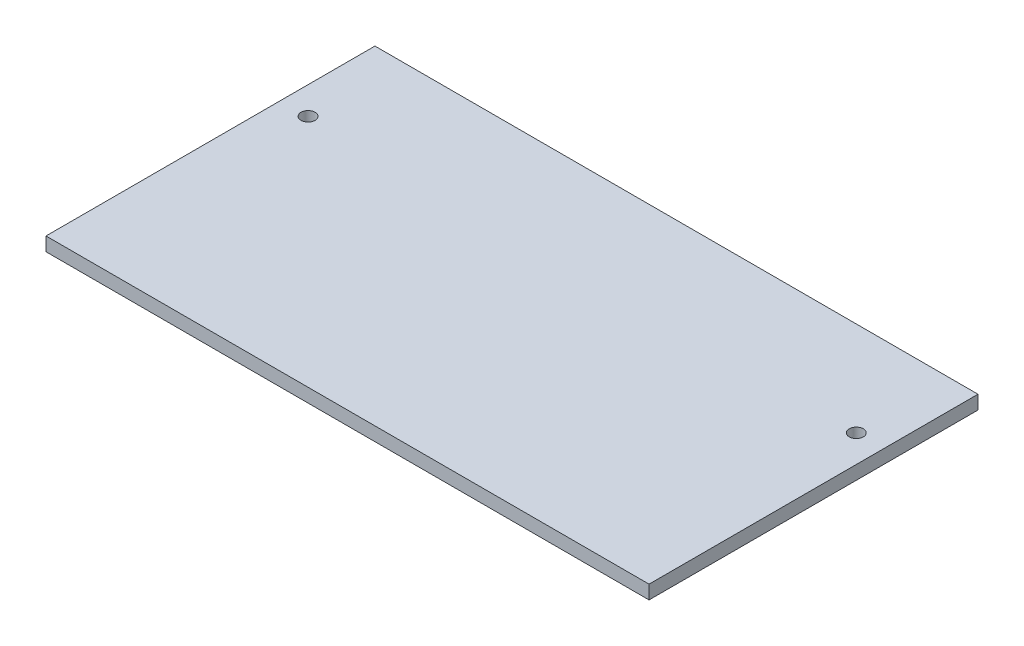
ISO-10303-21;
HEADER;
FILE_DESCRIPTION(('STEP AP214'),'2;1');
FILE_NAME('part.step','',(''),(''),'','','');
FILE_SCHEMA(('AUTOMOTIVE_DESIGN { 1 0 10303 214 1 1 1 1 }'));
ENDSEC;
DATA;
#1=APPLICATION_CONTEXT('core data for automotive mechanical design processes');
#2=APPLICATION_PROTOCOL_DEFINITION('international standard','automotive_design',2000,#1);
#3=PRODUCT_CONTEXT('',#1,'mechanical');
#4=PRODUCT('Part','Part','',(#3));
#5=PRODUCT_RELATED_PRODUCT_CATEGORY('part','',(#4));
#6=PRODUCT_DEFINITION_FORMATION('','',#4);
#7=PRODUCT_DEFINITION_CONTEXT('part definition',#1,'design');
#8=PRODUCT_DEFINITION('design','',#6,#7);
#9=PRODUCT_DEFINITION_SHAPE('','',#8);
#10=(LENGTH_UNIT() NAMED_UNIT(*) SI_UNIT(.MILLI.,.METRE.));
#11=(NAMED_UNIT(*) PLANE_ANGLE_UNIT() SI_UNIT($,.RADIAN.));
#12=(NAMED_UNIT(*) SI_UNIT($,.STERADIAN.) SOLID_ANGLE_UNIT());
#13=UNCERTAINTY_MEASURE_WITH_UNIT(LENGTH_MEASURE(1.E-05),#10,'distance_accuracy_value','');
#14=(GEOMETRIC_REPRESENTATION_CONTEXT(3) GLOBAL_UNCERTAINTY_ASSIGNED_CONTEXT((#13)) GLOBAL_UNIT_ASSIGNED_CONTEXT((#10,
#11,#12)) REPRESENTATION_CONTEXT('',''));
#15=CARTESIAN_POINT('',(0.,0.,0.));
#16=DIRECTION('',(0.,0.,1.));
#17=DIRECTION('',(1.,0.,0.));
#18=AXIS2_PLACEMENT_3D('',#15,#16,#17);
#19=CARTESIAN_POINT('',(-139.7,6.35,-76.2));
#20=DIRECTION('',(1.,0.,0.));
#21=DIRECTION('',(0.,0.,-1.));
#22=AXIS2_PLACEMENT_3D('',#19,#20,#21);
#23=PLANE('',#22);
#24=DIRECTION('',(0.,0.,1.));
#25=VECTOR('',#24,1.);
#26=CARTESIAN_POINT('',(-139.7,0.,-76.2));
#27=LINE('',#26,#25);
#28=CARTESIAN_POINT('',(-139.7,0.,-76.2));
#29=VERTEX_POINT('',#28);
#30=CARTESIAN_POINT('',(-139.7,0.,76.2));
#31=VERTEX_POINT('',#30);
#32=EDGE_CURVE('E102',#29,#31,#27,.T.);
#33=ORIENTED_EDGE('',*,*,#32,.T.);
#34=DIRECTION('',(0.,-1.,0.));
#35=VECTOR('',#34,1.);
#36=CARTESIAN_POINT('',(-139.7,6.35,76.2));
#37=LINE('',#36,#35);
#38=CARTESIAN_POINT('',(-139.7,6.35,76.2));
#39=VERTEX_POINT('',#38);
#40=EDGE_CURVE('E11',#39,#31,#37,.T.);
#41=ORIENTED_EDGE('',*,*,#40,.F.);
#42=DIRECTION('',(0.,0.,1.));
#43=VECTOR('',#42,1.);
#44=CARTESIAN_POINT('',(-139.7,6.35,-76.2));
#45=LINE('',#44,#43);
#46=CARTESIAN_POINT('',(-139.7,6.35,-76.2));
#47=VERTEX_POINT('',#46);
#48=EDGE_CURVE('E90',#47,#39,#45,.T.);
#49=ORIENTED_EDGE('',*,*,#48,.F.);
#50=DIRECTION('',(0.,-1.,0.));
#51=VECTOR('',#50,1.);
#52=CARTESIAN_POINT('',(-139.7,6.35,-76.2));
#53=LINE('',#52,#51);
#54=EDGE_CURVE('E98',#47,#29,#53,.T.);
#55=ORIENTED_EDGE('',*,*,#54,.T.);
#56=EDGE_LOOP('',(#33,#41,#49,#55));
#57=FACE_BOUND('',#56,.T.);
#58=ADVANCED_FACE('F39',(#57),#23,.F.);
#59=CARTESIAN_POINT('',(-139.7,6.35,76.2));
#60=DIRECTION('',(0.,0.,-1.));
#61=DIRECTION('',(-1.,0.,0.));
#62=AXIS2_PLACEMENT_3D('',#59,#60,#61);
#63=PLANE('',#62);
#64=DIRECTION('',(1.,0.,0.));
#65=VECTOR('',#64,1.);
#66=CARTESIAN_POINT('',(-139.7,0.,76.2));
#67=LINE('',#66,#65);
#68=CARTESIAN_POINT('',(139.7,0.,76.2));
#69=VERTEX_POINT('',#68);
#70=EDGE_CURVE('E94',#31,#69,#67,.T.);
#71=ORIENTED_EDGE('',*,*,#70,.T.);
#72=DIRECTION('',(0.,-1.,0.));
#73=VECTOR('',#72,1.);
#74=CARTESIAN_POINT('',(139.7,6.35,76.2));
#75=LINE('',#74,#73);
#76=CARTESIAN_POINT('',(139.7,6.35,76.2));
#77=VERTEX_POINT('',#76);
#78=EDGE_CURVE('E47',#77,#69,#75,.T.);
#79=ORIENTED_EDGE('',*,*,#78,.F.);
#80=DIRECTION('',(1.,0.,0.));
#81=VECTOR('',#80,1.);
#82=CARTESIAN_POINT('',(-139.7,6.35,76.2));
#83=LINE('',#82,#81);
#84=EDGE_CURVE('E85',#39,#77,#83,.T.);
#85=ORIENTED_EDGE('',*,*,#84,.F.);
#86=ORIENTED_EDGE('',*,*,#40,.T.);
#87=EDGE_LOOP('',(#71,#79,#85,#86));
#88=FACE_BOUND('',#87,.T.);
#89=ADVANCED_FACE('F93',(#88),#63,.F.);
#90=CARTESIAN_POINT('',(139.7,6.35,-76.2));
#91=DIRECTION('',(-1.,0.,0.));
#92=DIRECTION('',(0.,0.,1.));
#93=AXIS2_PLACEMENT_3D('',#90,#91,#92);
#94=PLANE('',#93);
#95=DIRECTION('',(0.,0.,-1.));
#96=VECTOR('',#95,1.);
#97=CARTESIAN_POINT('',(139.7,0.,-76.2));
#98=LINE('',#97,#96);
#99=CARTESIAN_POINT('',(139.7,0.,-76.2));
#100=VERTEX_POINT('',#99);
#101=EDGE_CURVE('E72',#69,#100,#98,.T.);
#102=ORIENTED_EDGE('',*,*,#101,.T.);
#103=DIRECTION('',(0.,-1.,0.));
#104=VECTOR('',#103,1.);
#105=CARTESIAN_POINT('',(139.7,6.35,-76.2));
#106=LINE('',#105,#104);
#107=CARTESIAN_POINT('',(139.7,6.35,-76.2));
#108=VERTEX_POINT('',#107);
#109=EDGE_CURVE('E95',#108,#100,#106,.T.);
#110=ORIENTED_EDGE('',*,*,#109,.F.);
#111=DIRECTION('',(0.,0.,-1.));
#112=VECTOR('',#111,1.);
#113=CARTESIAN_POINT('',(139.7,6.35,-76.2));
#114=LINE('',#113,#112);
#115=EDGE_CURVE('E88',#77,#108,#114,.T.);
#116=ORIENTED_EDGE('',*,*,#115,.F.);
#117=ORIENTED_EDGE('',*,*,#78,.T.);
#118=EDGE_LOOP('',(#102,#110,#116,#117));
#119=FACE_BOUND('',#118,.T.);
#120=ADVANCED_FACE('F96',(#119),#94,.F.);
#121=CARTESIAN_POINT('',(-139.7,6.35,-76.2));
#122=DIRECTION('',(0.,0.,1.));
#123=DIRECTION('',(1.,0.,0.));
#124=AXIS2_PLACEMENT_3D('',#121,#122,#123);
#125=PLANE('',#124);
#126=DIRECTION('',(-1.,0.,0.));
#127=VECTOR('',#126,1.);
#128=CARTESIAN_POINT('',(-139.7,0.,-76.2));
#129=LINE('',#128,#127);
#130=EDGE_CURVE('E78',#100,#29,#129,.T.);
#131=ORIENTED_EDGE('',*,*,#130,.T.);
#132=ORIENTED_EDGE('',*,*,#54,.F.);
#133=DIRECTION('',(-1.,0.,0.));
#134=VECTOR('',#133,1.);
#135=CARTESIAN_POINT('',(-139.7,6.35,-76.2));
#136=LINE('',#135,#134);
#137=EDGE_CURVE('E55',#108,#47,#136,.T.);
#138=ORIENTED_EDGE('',*,*,#137,.F.);
#139=ORIENTED_EDGE('',*,*,#109,.T.);
#140=EDGE_LOOP('',(#131,#132,#138,#139));
#141=FACE_BOUND('',#140,.T.);
#142=ADVANCED_FACE('F110',(#141),#125,.F.);
#143=CARTESIAN_POINT('',(0.,6.35,0.));
#144=DIRECTION('',(0.,1.,0.));
#145=DIRECTION('',(0.,0.,1.));
#146=AXIS2_PLACEMENT_3D('',#143,#144,#145);
#147=PLANE('',#146);
#148=CARTESIAN_POINT('',(-127.,6.35,-32.512));
#149=DIRECTION('',(0.,1.,0.));
#150=DIRECTION('',(0.,0.,1.));
#151=AXIS2_PLACEMENT_3D('',#148,#149,#150);
#152=CIRCLE('',#151,3.26389999999999);
#153=CARTESIAN_POINT('',(-127.,6.35,-29.2481));
#154=VERTEX_POINT('',#153);
#155=EDGE_CURVE('E124',#154,#154,#152,.T.);
#156=ORIENTED_EDGE('',*,*,#155,.F.);
#157=EDGE_LOOP('',(#156));
#158=FACE_BOUND('',#157,.T.);
#159=CARTESIAN_POINT('',(127.,6.35,-32.512));
#160=DIRECTION('',(0.,1.,0.));
#161=DIRECTION('',(0.,0.,1.));
#162=AXIS2_PLACEMENT_3D('',#159,#160,#161);
#163=CIRCLE('',#162,3.26389999999999);
#164=CARTESIAN_POINT('',(127.,6.35,-29.2481));
#165=VERTEX_POINT('',#164);
#166=EDGE_CURVE('E118',#165,#165,#163,.T.);
#167=ORIENTED_EDGE('',*,*,#166,.F.);
#168=EDGE_LOOP('',(#167));
#169=FACE_BOUND('',#168,.T.);
#170=ORIENTED_EDGE('',*,*,#48,.T.);
#171=ORIENTED_EDGE('',*,*,#84,.T.);
#172=ORIENTED_EDGE('',*,*,#115,.T.);
#173=ORIENTED_EDGE('',*,*,#137,.T.);
#174=EDGE_LOOP('',(#170,#171,#172,#173));
#175=FACE_BOUND('',#174,.T.);
#176=ADVANCED_FACE('F86',(#158,#169,#175),#147,.T.);
#177=CARTESIAN_POINT('',(0.,0.,0.));
#178=DIRECTION('',(0.,1.,0.));
#179=DIRECTION('',(0.,0.,1.));
#180=AXIS2_PLACEMENT_3D('',#177,#178,#179);
#181=PLANE('',#180);
#182=CARTESIAN_POINT('',(-127.,0.,-32.512));
#183=DIRECTION('',(0.,1.,0.));
#184=DIRECTION('',(0.,0.,1.));
#185=AXIS2_PLACEMENT_3D('',#182,#183,#184);
#186=CIRCLE('',#185,3.26389999999999);
#187=CARTESIAN_POINT('',(-127.,0.,-29.2481));
#188=VERTEX_POINT('',#187);
#189=EDGE_CURVE('E121',#188,#188,#186,.T.);
#190=ORIENTED_EDGE('',*,*,#189,.T.);
#191=EDGE_LOOP('',(#190));
#192=FACE_BOUND('',#191,.T.);
#193=CARTESIAN_POINT('',(127.,0.,-32.512));
#194=DIRECTION('',(0.,1.,0.));
#195=DIRECTION('',(0.,0.,1.));
#196=AXIS2_PLACEMENT_3D('',#193,#194,#195);
#197=CIRCLE('',#196,3.26389999999999);
#198=CARTESIAN_POINT('',(127.,0.,-29.2481));
#199=VERTEX_POINT('',#198);
#200=EDGE_CURVE('E105',#199,#199,#197,.T.);
#201=ORIENTED_EDGE('',*,*,#200,.T.);
#202=EDGE_LOOP('',(#201));
#203=FACE_BOUND('',#202,.T.);
#204=ORIENTED_EDGE('',*,*,#32,.F.);
#205=ORIENTED_EDGE('',*,*,#130,.F.);
#206=ORIENTED_EDGE('',*,*,#101,.F.);
#207=ORIENTED_EDGE('',*,*,#70,.F.);
#208=EDGE_LOOP('',(#204,#205,#206,#207));
#209=FACE_BOUND('',#208,.T.);
#210=ADVANCED_FACE('F113',(#192,#203,#209),#181,.F.);
#211=CARTESIAN_POINT('',(127.,6.35,-32.512));
#212=DIRECTION('',(0.,1.,0.));
#213=DIRECTION('',(0.,0.,1.));
#214=AXIS2_PLACEMENT_3D('',#211,#212,#213);
#215=CYLINDRICAL_SURFACE('',#214,3.26389999999999);
#216=ORIENTED_EDGE('',*,*,#200,.F.);
#217=EDGE_LOOP('',(#216));
#218=FACE_BOUND('',#217,.T.);
#219=ORIENTED_EDGE('',*,*,#166,.T.);
#220=EDGE_LOOP('',(#219));
#221=FACE_BOUND('',#220,.T.);
#222=ADVANCED_FACE('F135',(#218,#221),#215,.F.);
#223=CARTESIAN_POINT('',(-127.,6.35,-32.512));
#224=DIRECTION('',(0.,1.,0.));
#225=DIRECTION('',(0.,0.,1.));
#226=AXIS2_PLACEMENT_3D('',#223,#224,#225);
#227=CYLINDRICAL_SURFACE('',#226,3.26389999999999);
#228=ORIENTED_EDGE('',*,*,#189,.F.);
#229=EDGE_LOOP('',(#228));
#230=FACE_BOUND('',#229,.T.);
#231=ORIENTED_EDGE('',*,*,#155,.T.);
#232=EDGE_LOOP('',(#231));
#233=FACE_BOUND('',#232,.T.);
#234=ADVANCED_FACE('F128',(#230,#233),#227,.F.);
#235=CLOSED_SHELL('',(#58,#89,#120,#142,#176,#210,#222,#234));
#236=MANIFOLD_SOLID_BREP('B2',#235);
#237=ADVANCED_BREP_SHAPE_REPRESENTATION('',(#18,#236),#14);
#238=SHAPE_DEFINITION_REPRESENTATION(#9,#237);
ENDSEC;
END-ISO-10303-21;
